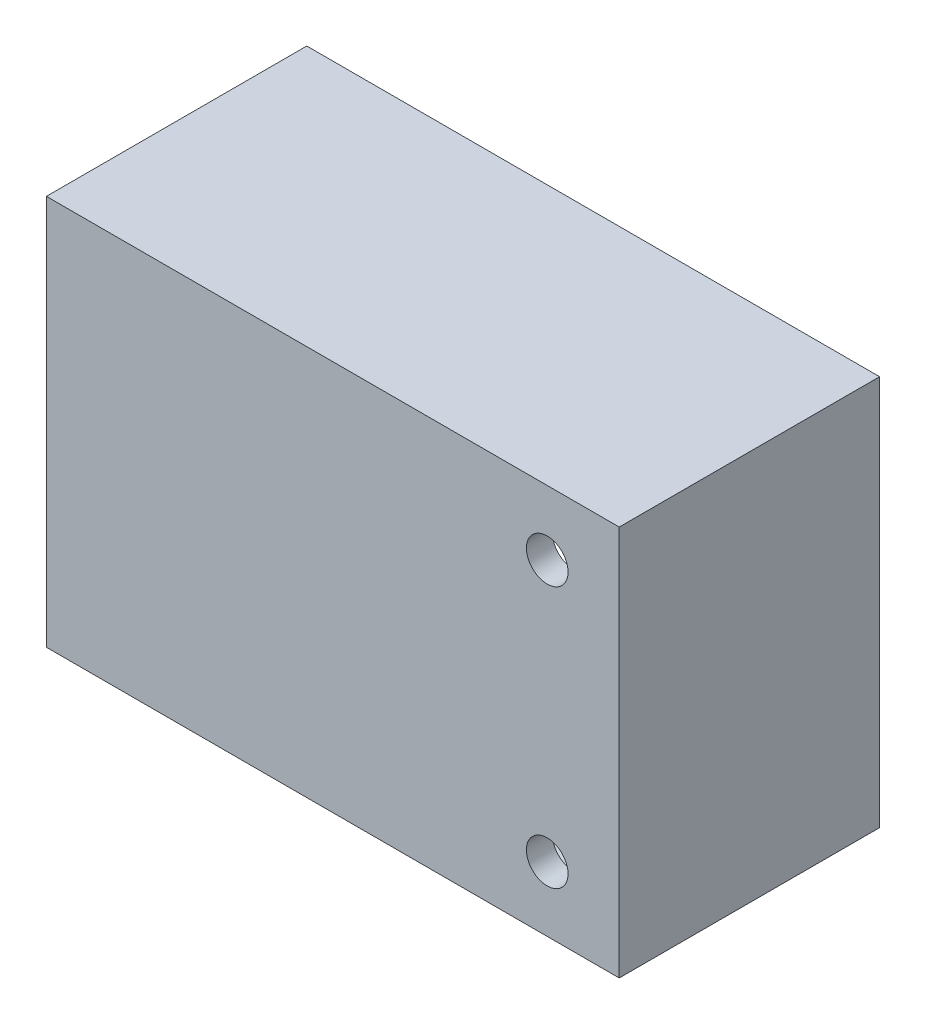
ISO-10303-21;
HEADER;
FILE_DESCRIPTION(('STEP AP214'),'2;1');
FILE_NAME('part.step','',(''),(''),'','','');
FILE_SCHEMA(('AUTOMOTIVE_DESIGN { 1 0 10303 214 1 1 1 1 }'));
ENDSEC;
DATA;
#1=APPLICATION_CONTEXT('core data for automotive mechanical design processes');
#2=APPLICATION_PROTOCOL_DEFINITION('international standard','automotive_design',2000,#1);
#3=PRODUCT_CONTEXT('',#1,'mechanical');
#4=PRODUCT('Part','Part','',(#3));
#5=PRODUCT_RELATED_PRODUCT_CATEGORY('part','',(#4));
#6=PRODUCT_DEFINITION_FORMATION('','',#4);
#7=PRODUCT_DEFINITION_CONTEXT('part definition',#1,'design');
#8=PRODUCT_DEFINITION('design','',#6,#7);
#9=PRODUCT_DEFINITION_SHAPE('','',#8);
#10=(LENGTH_UNIT() NAMED_UNIT(*) SI_UNIT(.MILLI.,.METRE.));
#11=(NAMED_UNIT(*) PLANE_ANGLE_UNIT() SI_UNIT($,.RADIAN.));
#12=(NAMED_UNIT(*) SI_UNIT($,.STERADIAN.) SOLID_ANGLE_UNIT());
#13=UNCERTAINTY_MEASURE_WITH_UNIT(LENGTH_MEASURE(1.E-05),#10,'distance_accuracy_value','');
#14=(GEOMETRIC_REPRESENTATION_CONTEXT(3) GLOBAL_UNCERTAINTY_ASSIGNED_CONTEXT((#13)) GLOBAL_UNIT_ASSIGNED_CONTEXT((#10,
#11,#12)) REPRESENTATION_CONTEXT('',''));
#15=CARTESIAN_POINT('',(0.,0.,0.));
#16=DIRECTION('',(0.,0.,1.));
#17=DIRECTION('',(1.,0.,0.));
#18=AXIS2_PLACEMENT_3D('',#15,#16,#17);
#19=CARTESIAN_POINT('',(2.,2.,20.));
#20=DIRECTION('',(1.,0.,0.));
#21=DIRECTION('',(0.,0.,-1.));
#22=AXIS2_PLACEMENT_3D('',#19,#20,#21);
#23=PLANE('',#22);
#24=DIRECTION('',(0.,0.,-1.));
#25=VECTOR('',#24,1.);
#26=CARTESIAN_POINT('',(2.,28.,20.));
#27=LINE('',#26,#25);
#28=CARTESIAN_POINT('',(2.,28.,18.));
#29=VERTEX_POINT('',#28);
#30=CARTESIAN_POINT('',(2.,28.,15.));
#31=VERTEX_POINT('',#30);
#32=EDGE_CURVE('E128',#29,#31,#27,.T.);
#33=ORIENTED_EDGE('',*,*,#32,.F.);
#34=DIRECTION('',(0.,-1.,0.));
#35=VECTOR('',#34,1.);
#36=CARTESIAN_POINT('',(2.,2.,18.));
#37=LINE('',#36,#35);
#38=CARTESIAN_POINT('',(2.,2.,18.));
#39=VERTEX_POINT('',#38);
#40=EDGE_CURVE('E48',#29,#39,#37,.T.);
#41=ORIENTED_EDGE('',*,*,#40,.T.);
#42=DIRECTION('',(0.,0.,-1.));
#43=VECTOR('',#42,1.);
#44=CARTESIAN_POINT('',(2.,2.,20.));
#45=LINE('',#44,#43);
#46=CARTESIAN_POINT('',(2.,2.,15.));
#47=VERTEX_POINT('',#46);
#48=EDGE_CURVE('E54',#39,#47,#45,.T.);
#49=ORIENTED_EDGE('',*,*,#48,.T.);
#50=DIRECTION('',(0.,-1.,0.));
#51=VECTOR('',#50,1.);
#52=CARTESIAN_POINT('',(2.,2.,15.));
#53=LINE('',#52,#51);
#54=EDGE_CURVE('E204',#31,#47,#53,.T.);
#55=ORIENTED_EDGE('',*,*,#54,.F.);
#56=EDGE_LOOP('',(#33,#41,#49,#55));
#57=FACE_BOUND('',#56,.T.);
#58=ADVANCED_FACE('F33',(#57),#23,.T.);
#59=CARTESIAN_POINT('',(2.,2.,20.));
#60=DIRECTION('',(0.,1.,0.));
#61=DIRECTION('',(0.,0.,1.));
#62=AXIS2_PLACEMENT_3D('',#59,#60,#61);
#63=PLANE('',#62);
#64=ORIENTED_EDGE('',*,*,#48,.F.);
#65=DIRECTION('',(1.,0.,0.));
#66=VECTOR('',#65,1.);
#67=CARTESIAN_POINT('',(2.,2.,18.));
#68=LINE('',#67,#66);
#69=CARTESIAN_POINT('',(42.,2.,18.));
#70=VERTEX_POINT('',#69);
#71=EDGE_CURVE('E121',#39,#70,#68,.T.);
#72=ORIENTED_EDGE('',*,*,#71,.T.);
#73=DIRECTION('',(0.,0.,-1.));
#74=VECTOR('',#73,1.);
#75=CARTESIAN_POINT('',(42.,2.,20.));
#76=LINE('',#75,#74);
#77=CARTESIAN_POINT('',(42.,2.,0.));
#78=VERTEX_POINT('',#77);
#79=EDGE_CURVE('E120',#70,#78,#76,.T.);
#80=ORIENTED_EDGE('',*,*,#79,.T.);
#81=DIRECTION('',(1.,0.,0.));
#82=VECTOR('',#81,1.);
#83=CARTESIAN_POINT('',(2.,2.,0.));
#84=LINE('',#83,#82);
#85=CARTESIAN_POINT('',(0.,2.,0.));
#86=VERTEX_POINT('',#85);
#87=EDGE_CURVE('E208',#86,#78,#84,.T.);
#88=ORIENTED_EDGE('',*,*,#87,.F.);
#89=DIRECTION('',(0.,0.,1.));
#90=VECTOR('',#89,1.);
#91=CARTESIAN_POINT('',(0.,2.,0.));
#92=LINE('',#91,#90);
#93=CARTESIAN_POINT('',(0.,2.,15.));
#94=VERTEX_POINT('',#93);
#95=EDGE_CURVE('E175',#86,#94,#92,.T.);
#96=ORIENTED_EDGE('',*,*,#95,.T.);
#97=DIRECTION('',(-1.,0.,0.));
#98=VECTOR('',#97,1.);
#99=CARTESIAN_POINT('',(20.,2.,15.));
#100=LINE('',#99,#98);
#101=EDGE_CURVE('E197',#47,#94,#100,.T.);
#102=ORIENTED_EDGE('',*,*,#101,.F.);
#103=EDGE_LOOP('',(#64,#72,#80,#88,#96,#102));
#104=FACE_BOUND('',#103,.T.);
#105=ADVANCED_FACE('F211',(#104),#63,.T.);
#106=CARTESIAN_POINT('',(42.,2.,20.));
#107=DIRECTION('',(-1.,0.,0.));
#108=DIRECTION('',(0.,0.,1.));
#109=AXIS2_PLACEMENT_3D('',#106,#107,#108);
#110=PLANE('',#109);
#111=ORIENTED_EDGE('',*,*,#79,.F.);
#112=DIRECTION('',(0.,1.,0.));
#113=VECTOR('',#112,1.);
#114=CARTESIAN_POINT('',(42.,2.,18.));
#115=LINE('',#114,#113);
#116=CARTESIAN_POINT('',(42.,28.,18.));
#117=VERTEX_POINT('',#116);
#118=EDGE_CURVE('E109',#70,#117,#115,.T.);
#119=ORIENTED_EDGE('',*,*,#118,.T.);
#120=DIRECTION('',(0.,0.,-1.));
#121=VECTOR('',#120,1.);
#122=CARTESIAN_POINT('',(42.,28.,20.));
#123=LINE('',#122,#121);
#124=CARTESIAN_POINT('',(42.,28.,0.));
#125=VERTEX_POINT('',#124);
#126=EDGE_CURVE('E118',#117,#125,#123,.T.);
#127=ORIENTED_EDGE('',*,*,#126,.T.);
#128=DIRECTION('',(0.,1.,0.));
#129=VECTOR('',#128,1.);
#130=CARTESIAN_POINT('',(42.,2.,0.));
#131=LINE('',#130,#129);
#132=EDGE_CURVE('E192',#78,#125,#131,.T.);
#133=ORIENTED_EDGE('',*,*,#132,.F.);
#134=EDGE_LOOP('',(#111,#119,#127,#133));
#135=FACE_BOUND('',#134,.T.);
#136=ADVANCED_FACE('F116',(#135),#110,.T.);
#137=CARTESIAN_POINT('',(2.,28.,20.));
#138=DIRECTION('',(0.,-1.,0.));
#139=DIRECTION('',(0.,0.,-1.));
#140=AXIS2_PLACEMENT_3D('',#137,#138,#139);
#141=PLANE('',#140);
#142=ORIENTED_EDGE('',*,*,#126,.F.);
#143=DIRECTION('',(-1.,0.,0.));
#144=VECTOR('',#143,1.);
#145=CARTESIAN_POINT('',(2.,28.,18.));
#146=LINE('',#145,#144);
#147=EDGE_CURVE('E11',#117,#29,#146,.T.);
#148=ORIENTED_EDGE('',*,*,#147,.T.);
#149=ORIENTED_EDGE('',*,*,#32,.T.);
#150=DIRECTION('',(-1.,0.,0.));
#151=VECTOR('',#150,1.);
#152=CARTESIAN_POINT('',(20.,28.,15.));
#153=LINE('',#152,#151);
#154=CARTESIAN_POINT('',(0.,28.,15.));
#155=VERTEX_POINT('',#154);
#156=EDGE_CURVE('E195',#31,#155,#153,.T.);
#157=ORIENTED_EDGE('',*,*,#156,.T.);
#158=DIRECTION('',(0.,0.,-1.));
#159=VECTOR('',#158,1.);
#160=CARTESIAN_POINT('',(0.,28.,0.));
#161=LINE('',#160,#159);
#162=CARTESIAN_POINT('',(0.,28.,0.));
#163=VERTEX_POINT('',#162);
#164=EDGE_CURVE('E193',#155,#163,#161,.T.);
#165=ORIENTED_EDGE('',*,*,#164,.T.);
#166=DIRECTION('',(-1.,0.,0.));
#167=VECTOR('',#166,1.);
#168=CARTESIAN_POINT('',(2.,28.,0.));
#169=LINE('',#168,#167);
#170=EDGE_CURVE('E126',#125,#163,#169,.T.);
#171=ORIENTED_EDGE('',*,*,#170,.F.);
#172=EDGE_LOOP('',(#142,#148,#149,#157,#165,#171));
#173=FACE_BOUND('',#172,.T.);
#174=ADVANCED_FACE('F124',(#173),#141,.T.);
#175=CARTESIAN_POINT('',(0.,0.,20.));
#176=DIRECTION('',(0.,0.,-1.));
#177=DIRECTION('',(-1.,0.,0.));
#178=AXIS2_PLACEMENT_3D('',#175,#176,#177);
#179=PLANE('',#178);
#180=CARTESIAN_POINT('',(38.47,4.96,20.));
#181=DIRECTION('',(0.,0.,1.));
#182=DIRECTION('',(-1.,0.,0.));
#183=AXIS2_PLACEMENT_3D('',#180,#181,#182);
#184=CIRCLE('',#183,1.6);
#185=CARTESIAN_POINT('',(36.87,4.96,20.));
#186=VERTEX_POINT('',#185);
#187=EDGE_CURVE('E221',#186,#186,#184,.T.);
#188=ORIENTED_EDGE('',*,*,#187,.F.);
#189=EDGE_LOOP('',(#188));
#190=FACE_BOUND('',#189,.T.);
#191=CARTESIAN_POINT('',(38.47,25.04,20.));
#192=DIRECTION('',(0.,0.,1.));
#193=DIRECTION('',(1.,0.,0.));
#194=AXIS2_PLACEMENT_3D('',#191,#192,#193);
#195=CIRCLE('',#194,1.6);
#196=CARTESIAN_POINT('',(40.07,25.04,20.));
#197=VERTEX_POINT('',#196);
#198=EDGE_CURVE('E215',#197,#197,#195,.T.);
#199=ORIENTED_EDGE('',*,*,#198,.F.);
#200=EDGE_LOOP('',(#199));
#201=FACE_BOUND('',#200,.T.);
#202=DIRECTION('',(0.,-1.,0.));
#203=VECTOR('',#202,1.);
#204=CARTESIAN_POINT('',(0.,0.,20.));
#205=LINE('',#204,#203);
#206=CARTESIAN_POINT('',(0.,30.,20.));
#207=VERTEX_POINT('',#206);
#208=CARTESIAN_POINT('',(0.,0.,20.));
#209=VERTEX_POINT('',#208);
#210=EDGE_CURVE('E136',#207,#209,#205,.T.);
#211=ORIENTED_EDGE('',*,*,#210,.T.);
#212=DIRECTION('',(1.,0.,0.));
#213=VECTOR('',#212,1.);
#214=CARTESIAN_POINT('',(0.,0.,20.));
#215=LINE('',#214,#213);
#216=CARTESIAN_POINT('',(44.,0.,20.));
#217=VERTEX_POINT('',#216);
#218=EDGE_CURVE('E139',#209,#217,#215,.T.);
#219=ORIENTED_EDGE('',*,*,#218,.T.);
#220=DIRECTION('',(0.,1.,0.));
#221=VECTOR('',#220,1.);
#222=CARTESIAN_POINT('',(44.,0.,20.));
#223=LINE('',#222,#221);
#224=CARTESIAN_POINT('',(44.,30.,20.));
#225=VERTEX_POINT('',#224);
#226=EDGE_CURVE('E142',#217,#225,#223,.T.);
#227=ORIENTED_EDGE('',*,*,#226,.T.);
#228=DIRECTION('',(-1.,0.,0.));
#229=VECTOR('',#228,1.);
#230=CARTESIAN_POINT('',(0.,30.,20.));
#231=LINE('',#230,#229);
#232=EDGE_CURVE('E144',#225,#207,#231,.T.);
#233=ORIENTED_EDGE('',*,*,#232,.T.);
#234=EDGE_LOOP('',(#211,#219,#227,#233));
#235=FACE_BOUND('',#234,.T.);
#236=ADVANCED_FACE('F187',(#190,#201,#235),#179,.F.);
#237=CARTESIAN_POINT('',(0.,0.,0.));
#238=DIRECTION('',(0.,0.,-1.));
#239=DIRECTION('',(-1.,0.,0.));
#240=AXIS2_PLACEMENT_3D('',#237,#238,#239);
#241=PLANE('',#240);
#242=ORIENTED_EDGE('',*,*,#170,.T.);
#243=DIRECTION('',(0.,-1.,0.));
#244=VECTOR('',#243,1.);
#245=CARTESIAN_POINT('',(0.,0.,0.));
#246=LINE('',#245,#244);
#247=CARTESIAN_POINT('',(0.,30.,0.));
#248=VERTEX_POINT('',#247);
#249=EDGE_CURVE('E147',#248,#163,#246,.T.);
#250=ORIENTED_EDGE('',*,*,#249,.F.);
#251=DIRECTION('',(-1.,0.,0.));
#252=VECTOR('',#251,1.);
#253=CARTESIAN_POINT('',(0.,30.,0.));
#254=LINE('',#253,#252);
#255=CARTESIAN_POINT('',(44.,30.,0.));
#256=VERTEX_POINT('',#255);
#257=EDGE_CURVE('E140',#256,#248,#254,.T.);
#258=ORIENTED_EDGE('',*,*,#257,.F.);
#259=DIRECTION('',(0.,1.,0.));
#260=VECTOR('',#259,1.);
#261=CARTESIAN_POINT('',(44.,0.,0.));
#262=LINE('',#261,#260);
#263=CARTESIAN_POINT('',(44.,0.,0.));
#264=VERTEX_POINT('',#263);
#265=EDGE_CURVE('E153',#264,#256,#262,.T.);
#266=ORIENTED_EDGE('',*,*,#265,.F.);
#267=DIRECTION('',(1.,0.,0.));
#268=VECTOR('',#267,1.);
#269=CARTESIAN_POINT('',(0.,0.,0.));
#270=LINE('',#269,#268);
#271=CARTESIAN_POINT('',(0.,0.,0.));
#272=VERTEX_POINT('',#271);
#273=EDGE_CURVE('E150',#272,#264,#270,.T.);
#274=ORIENTED_EDGE('',*,*,#273,.F.);
#275=EDGE_CURVE('E135',#86,#272,#246,.T.);
#276=ORIENTED_EDGE('',*,*,#275,.F.);
#277=ORIENTED_EDGE('',*,*,#87,.T.);
#278=ORIENTED_EDGE('',*,*,#132,.T.);
#279=EDGE_LOOP('',(#242,#250,#258,#266,#274,#276,#277,#278));
#280=FACE_BOUND('',#279,.T.);
#281=ADVANCED_FACE('F178',(#280),#241,.T.);
#282=CARTESIAN_POINT('',(0.,0.,20.));
#283=DIRECTION('',(1.,0.,0.));
#284=DIRECTION('',(0.,0.,-1.));
#285=AXIS2_PLACEMENT_3D('',#282,#283,#284);
#286=PLANE('',#285);
#287=DIRECTION('',(0.,0.,-1.));
#288=VECTOR('',#287,1.);
#289=CARTESIAN_POINT('',(0.,30.,20.));
#290=LINE('',#289,#288);
#291=EDGE_CURVE('E146',#207,#248,#290,.T.);
#292=ORIENTED_EDGE('',*,*,#291,.T.);
#293=ORIENTED_EDGE('',*,*,#249,.T.);
#294=ORIENTED_EDGE('',*,*,#164,.F.);
#295=DIRECTION('',(0.,1.,0.));
#296=VECTOR('',#295,1.);
#297=CARTESIAN_POINT('',(0.,28.,15.));
#298=LINE('',#297,#296);
#299=EDGE_CURVE('E198',#94,#155,#298,.T.);
#300=ORIENTED_EDGE('',*,*,#299,.F.);
#301=ORIENTED_EDGE('',*,*,#95,.F.);
#302=ORIENTED_EDGE('',*,*,#275,.T.);
#303=DIRECTION('',(0.,0.,-1.));
#304=VECTOR('',#303,1.);
#305=CARTESIAN_POINT('',(0.,0.,20.));
#306=LINE('',#305,#304);
#307=EDGE_CURVE('E41',#209,#272,#306,.T.);
#308=ORIENTED_EDGE('',*,*,#307,.F.);
#309=ORIENTED_EDGE('',*,*,#210,.F.);
#310=EDGE_LOOP('',(#292,#293,#294,#300,#301,#302,#308,#309));
#311=FACE_BOUND('',#310,.T.);
#312=ADVANCED_FACE('F35',(#311),#286,.F.);
#313=CARTESIAN_POINT('',(0.,0.,20.));
#314=DIRECTION('',(0.,1.,0.));
#315=DIRECTION('',(0.,0.,1.));
#316=AXIS2_PLACEMENT_3D('',#313,#314,#315);
#317=PLANE('',#316);
#318=ORIENTED_EDGE('',*,*,#307,.T.);
#319=ORIENTED_EDGE('',*,*,#273,.T.);
#320=DIRECTION('',(0.,0.,-1.));
#321=VECTOR('',#320,1.);
#322=CARTESIAN_POINT('',(44.,0.,20.));
#323=LINE('',#322,#321);
#324=EDGE_CURVE('E161',#217,#264,#323,.T.);
#325=ORIENTED_EDGE('',*,*,#324,.F.);
#326=ORIENTED_EDGE('',*,*,#218,.F.);
#327=EDGE_LOOP('',(#318,#319,#325,#326));
#328=FACE_BOUND('',#327,.T.);
#329=ADVANCED_FACE('F165',(#328),#317,.F.);
#330=CARTESIAN_POINT('',(44.,0.,20.));
#331=DIRECTION('',(-1.,0.,0.));
#332=DIRECTION('',(0.,0.,1.));
#333=AXIS2_PLACEMENT_3D('',#330,#331,#332);
#334=PLANE('',#333);
#335=ORIENTED_EDGE('',*,*,#324,.T.);
#336=ORIENTED_EDGE('',*,*,#265,.T.);
#337=DIRECTION('',(0.,0.,-1.));
#338=VECTOR('',#337,1.);
#339=CARTESIAN_POINT('',(44.,30.,20.));
#340=LINE('',#339,#338);
#341=EDGE_CURVE('E159',#225,#256,#340,.T.);
#342=ORIENTED_EDGE('',*,*,#341,.F.);
#343=ORIENTED_EDGE('',*,*,#226,.F.);
#344=EDGE_LOOP('',(#335,#336,#342,#343));
#345=FACE_BOUND('',#344,.T.);
#346=ADVANCED_FACE('F183',(#345),#334,.F.);
#347=CARTESIAN_POINT('',(0.,30.,20.));
#348=DIRECTION('',(0.,-1.,0.));
#349=DIRECTION('',(0.,0.,-1.));
#350=AXIS2_PLACEMENT_3D('',#347,#348,#349);
#351=PLANE('',#350);
#352=ORIENTED_EDGE('',*,*,#341,.T.);
#353=ORIENTED_EDGE('',*,*,#257,.T.);
#354=ORIENTED_EDGE('',*,*,#291,.F.);
#355=ORIENTED_EDGE('',*,*,#232,.F.);
#356=EDGE_LOOP('',(#352,#353,#354,#355));
#357=FACE_BOUND('',#356,.T.);
#358=ADVANCED_FACE('F191',(#357),#351,.F.);
#359=CARTESIAN_POINT('',(20.,28.,15.));
#360=DIRECTION('',(0.,0.,1.));
#361=DIRECTION('',(0.,-1.,0.));
#362=AXIS2_PLACEMENT_3D('',#359,#360,#361);
#363=PLANE('',#362);
#364=ORIENTED_EDGE('',*,*,#54,.T.);
#365=ORIENTED_EDGE('',*,*,#101,.T.);
#366=ORIENTED_EDGE('',*,*,#299,.T.);
#367=ORIENTED_EDGE('',*,*,#156,.F.);
#368=EDGE_LOOP('',(#364,#365,#366,#367));
#369=FACE_BOUND('',#368,.T.);
#370=ADVANCED_FACE('F247',(#369),#363,.F.);
#371=CARTESIAN_POINT('',(0.,0.,18.));
#372=DIRECTION('',(0.,0.,1.));
#373=DIRECTION('',(1.,0.,0.));
#374=AXIS2_PLACEMENT_3D('',#371,#372,#373);
#375=PLANE('',#374);
#376=CARTESIAN_POINT('',(38.47,4.96,18.));
#377=DIRECTION('',(0.,0.,1.));
#378=DIRECTION('',(-1.,0.,0.));
#379=AXIS2_PLACEMENT_3D('',#376,#377,#378);
#380=CIRCLE('',#379,1.6);
#381=CARTESIAN_POINT('',(36.87,4.96,18.));
#382=VERTEX_POINT('',#381);
#383=EDGE_CURVE('E122',#382,#382,#380,.T.);
#384=ORIENTED_EDGE('',*,*,#383,.T.);
#385=EDGE_LOOP('',(#384));
#386=FACE_BOUND('',#385,.T.);
#387=CARTESIAN_POINT('',(38.47,25.04,18.));
#388=DIRECTION('',(0.,0.,1.));
#389=DIRECTION('',(1.,0.,0.));
#390=AXIS2_PLACEMENT_3D('',#387,#388,#389);
#391=CIRCLE('',#390,1.6);
#392=CARTESIAN_POINT('',(40.07,25.04,18.));
#393=VERTEX_POINT('',#392);
#394=EDGE_CURVE('E218',#393,#393,#391,.T.);
#395=ORIENTED_EDGE('',*,*,#394,.T.);
#396=EDGE_LOOP('',(#395));
#397=FACE_BOUND('',#396,.T.);
#398=ORIENTED_EDGE('',*,*,#40,.F.);
#399=ORIENTED_EDGE('',*,*,#147,.F.);
#400=ORIENTED_EDGE('',*,*,#118,.F.);
#401=ORIENTED_EDGE('',*,*,#71,.F.);
#402=EDGE_LOOP('',(#398,#399,#400,#401));
#403=FACE_BOUND('',#402,.T.);
#404=ADVANCED_FACE('F108',(#386,#397,#403),#375,.F.);
#405=CARTESIAN_POINT('',(38.47,25.04,18.));
#406=DIRECTION('',(0.,0.,1.));
#407=DIRECTION('',(1.,0.,0.));
#408=AXIS2_PLACEMENT_3D('',#405,#406,#407);
#409=CYLINDRICAL_SURFACE('',#408,1.6);
#410=ORIENTED_EDGE('',*,*,#394,.F.);
#411=EDGE_LOOP('',(#410));
#412=FACE_BOUND('',#411,.T.);
#413=ORIENTED_EDGE('',*,*,#198,.T.);
#414=EDGE_LOOP('',(#413));
#415=FACE_BOUND('',#414,.T.);
#416=ADVANCED_FACE('F232',(#412,#415),#409,.F.);
#417=CARTESIAN_POINT('',(38.47,4.96,18.));
#418=DIRECTION('',(0.,0.,1.));
#419=DIRECTION('',(1.,0.,0.));
#420=AXIS2_PLACEMENT_3D('',#417,#418,#419);
#421=CYLINDRICAL_SURFACE('',#420,1.6);
#422=ORIENTED_EDGE('',*,*,#383,.F.);
#423=EDGE_LOOP('',(#422));
#424=FACE_BOUND('',#423,.T.);
#425=ORIENTED_EDGE('',*,*,#187,.T.);
#426=EDGE_LOOP('',(#425));
#427=FACE_BOUND('',#426,.T.);
#428=ADVANCED_FACE('F229',(#424,#427),#421,.F.);
#429=CLOSED_SHELL('',(#58,#105,#136,#174,#236,#281,#312,#329,#346,#358,#370,#404,#416,#428));
#430=MANIFOLD_SOLID_BREP('B2',#429);
#431=ADVANCED_BREP_SHAPE_REPRESENTATION('',(#18,#430),#14);
#432=SHAPE_DEFINITION_REPRESENTATION(#9,#431);
ENDSEC;
END-ISO-10303-21;
